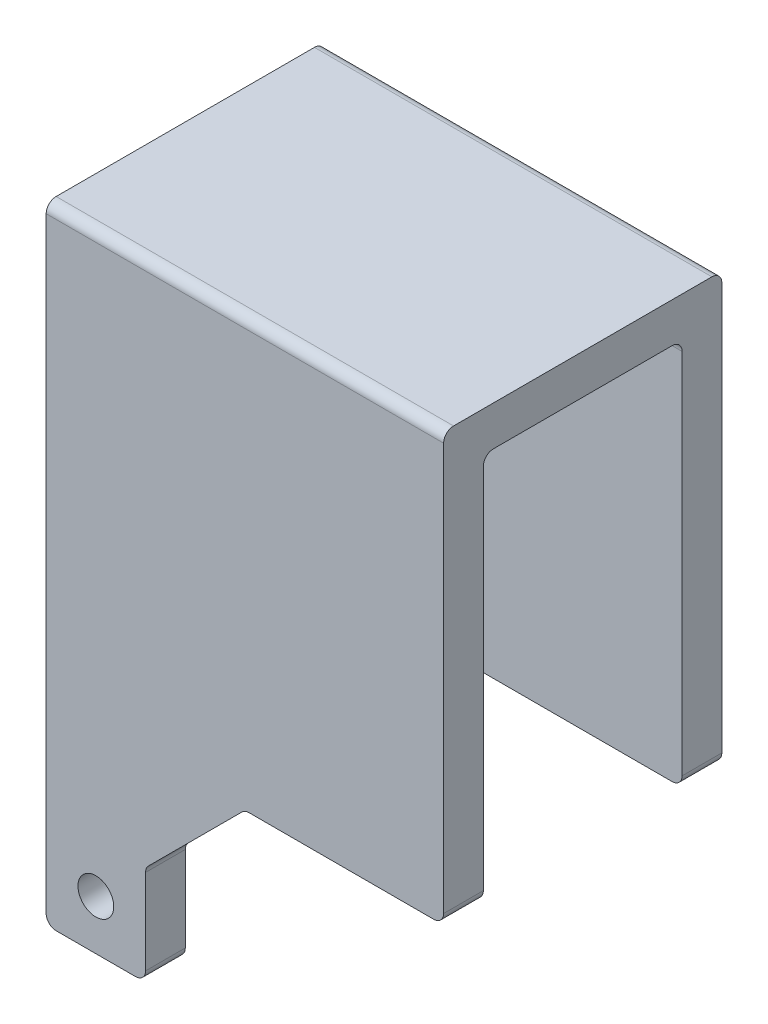
ISO-10303-21;
HEADER;
FILE_DESCRIPTION(('STEP AP214'),'2;1');
FILE_NAME('part.step','',(''),(''),'','','');
FILE_SCHEMA(('AUTOMOTIVE_DESIGN { 1 0 10303 214 1 1 1 1 }'));
ENDSEC;
DATA;
#1=APPLICATION_CONTEXT('core data for automotive mechanical design processes');
#2=APPLICATION_PROTOCOL_DEFINITION('international standard','automotive_design',2000,#1);
#3=PRODUCT_CONTEXT('',#1,'mechanical');
#4=PRODUCT('Part','Part','',(#3));
#5=PRODUCT_RELATED_PRODUCT_CATEGORY('part','',(#4));
#6=PRODUCT_DEFINITION_FORMATION('','',#4);
#7=PRODUCT_DEFINITION_CONTEXT('part definition',#1,'design');
#8=PRODUCT_DEFINITION('design','',#6,#7);
#9=PRODUCT_DEFINITION_SHAPE('','',#8);
#10=(LENGTH_UNIT() NAMED_UNIT(*) SI_UNIT(.MILLI.,.METRE.));
#11=(NAMED_UNIT(*) PLANE_ANGLE_UNIT() SI_UNIT($,.RADIAN.));
#12=(NAMED_UNIT(*) SI_UNIT($,.STERADIAN.) SOLID_ANGLE_UNIT());
#13=UNCERTAINTY_MEASURE_WITH_UNIT(LENGTH_MEASURE(1.E-05),#10,'distance_accuracy_value','');
#14=(GEOMETRIC_REPRESENTATION_CONTEXT(3) GLOBAL_UNCERTAINTY_ASSIGNED_CONTEXT((#13)) GLOBAL_UNIT_ASSIGNED_CONTEXT((#10,
#11,#12)) REPRESENTATION_CONTEXT('',''));
#15=CARTESIAN_POINT('',(0.,0.,0.));
#16=DIRECTION('',(0.,0.,1.));
#17=DIRECTION('',(1.,0.,0.));
#18=AXIS2_PLACEMENT_3D('',#15,#16,#17);
#19=CARTESIAN_POINT('',(0.,0.,-24.));
#20=DIRECTION('',(0.,0.,1.));
#21=DIRECTION('',(1.,0.,0.));
#22=AXIS2_PLACEMENT_3D('',#19,#20,#21);
#23=PLANE('',#22);
#24=DIRECTION('',(0.,-1.,0.));
#25=VECTOR('',#24,1.);
#26=CARTESIAN_POINT('',(20.,21.5,-24.));
#27=LINE('',#26,#25);
#28=CARTESIAN_POINT('',(20.,20.5,-24.));
#29=VERTEX_POINT('',#28);
#30=CARTESIAN_POINT('',(20.,-20.5,-24.));
#31=VERTEX_POINT('',#30);
#32=EDGE_CURVE('E518',#29,#31,#27,.T.);
#33=ORIENTED_EDGE('',*,*,#32,.T.);
#34=CARTESIAN_POINT('',(19.,-20.5,-24.));
#35=DIRECTION('',(0.,0.,1.));
#36=DIRECTION('',(1.,0.,0.));
#37=AXIS2_PLACEMENT_3D('',#34,#35,#36);
#38=CIRCLE('',#37,1.);
#39=CARTESIAN_POINT('',(19.,-21.5,-24.));
#40=VERTEX_POINT('',#39);
#41=EDGE_CURVE('E386',#31,#40,#38,.F.);
#42=ORIENTED_EDGE('',*,*,#41,.T.);
#43=DIRECTION('',(-1.,0.,0.));
#44=VECTOR('',#43,1.);
#45=CARTESIAN_POINT('',(-20.,-21.5,-24.));
#46=LINE('',#45,#44);
#47=CARTESIAN_POINT('',(0.414213562373093,-21.5,-24.));
#48=VERTEX_POINT('',#47);
#49=EDGE_CURVE('E246',#40,#48,#46,.T.);
#50=ORIENTED_EDGE('',*,*,#49,.T.);
#51=DIRECTION('',(0.,-1.,0.));
#52=VECTOR('',#51,1.);
#53=CARTESIAN_POINT('',(0.414213562373092,-17.5,-24.));
#54=LINE('',#53,#52);
#55=CARTESIAN_POINT('',(0.414213562373092,-16.5,-24.));
#56=VERTEX_POINT('',#55);
#57=EDGE_CURVE('E61',#48,#56,#54,.F.);
#58=ORIENTED_EDGE('',*,*,#57,.T.);
#59=DIRECTION('',(1.,0.,0.));
#60=VECTOR('',#59,1.);
#61=CARTESIAN_POINT('',(-20.,-16.5,-24.));
#62=LINE('',#61,#60);
#63=CARTESIAN_POINT('',(-20.,-16.5,-24.));
#64=VERTEX_POINT('',#63);
#65=EDGE_CURVE('E381',#56,#64,#62,.F.);
#66=ORIENTED_EDGE('',*,*,#65,.T.);
#67=DIRECTION('',(0.,1.,0.));
#68=VECTOR('',#67,1.);
#69=CARTESIAN_POINT('',(-20.,21.5,-24.));
#70=LINE('',#69,#68);
#71=CARTESIAN_POINT('',(-20.,20.5,-24.));
#72=VERTEX_POINT('',#71);
#73=EDGE_CURVE('E235',#64,#72,#70,.T.);
#74=ORIENTED_EDGE('',*,*,#73,.T.);
#75=DIRECTION('',(1.,0.,0.));
#76=VECTOR('',#75,1.);
#77=CARTESIAN_POINT('',(20.,20.5,-24.));
#78=LINE('',#77,#76);
#79=EDGE_CURVE('E383',#72,#29,#78,.T.);
#80=ORIENTED_EDGE('',*,*,#79,.T.);
#81=EDGE_LOOP('',(#33,#42,#50,#58,#66,#74,#80));
#82=FACE_BOUND('',#81,.T.);
#83=ADVANCED_FACE('F37',(#82),#23,.F.);
#84=CARTESIAN_POINT('',(0.,0.,0.));
#85=DIRECTION('',(0.,0.,1.));
#86=DIRECTION('',(1.,0.,0.));
#87=AXIS2_PLACEMENT_3D('',#84,#85,#86);
#88=PLANE('',#87);
#89=CARTESIAN_POINT('',(-15.,-36.5,0.));
#90=DIRECTION('',(0.,0.,1.));
#91=DIRECTION('',(1.,0.,0.));
#92=AXIS2_PLACEMENT_3D('',#89,#90,#91);
#93=CIRCLE('',#92,1.8);
#94=CARTESIAN_POINT('',(-13.2,-36.5,0.));
#95=VERTEX_POINT('',#94);
#96=EDGE_CURVE('E273',#95,#95,#93,.T.);
#97=ORIENTED_EDGE('',*,*,#96,.T.);
#98=EDGE_LOOP('',(#97));
#99=FACE_BOUND('',#98,.T.);
#100=DIRECTION('',(0.,1.,0.));
#101=VECTOR('',#100,1.);
#102=CARTESIAN_POINT('',(20.,0.,0.));
#103=LINE('',#102,#101);
#104=CARTESIAN_POINT('',(20.,-20.5,0.));
#105=VERTEX_POINT('',#104);
#106=CARTESIAN_POINT('',(20.,16.5,0.));
#107=VERTEX_POINT('',#106);
#108=EDGE_CURVE('E291',#105,#107,#103,.T.);
#109=ORIENTED_EDGE('',*,*,#108,.F.);
#110=CARTESIAN_POINT('',(19.,-20.5,0.));
#111=DIRECTION('',(0.,0.,1.));
#112=DIRECTION('',(1.,0.,0.));
#113=AXIS2_PLACEMENT_3D('',#110,#111,#112);
#114=CIRCLE('',#113,1.);
#115=CARTESIAN_POINT('',(19.,-21.5,0.));
#116=VERTEX_POINT('',#115);
#117=EDGE_CURVE('E362',#105,#116,#114,.F.);
#118=ORIENTED_EDGE('',*,*,#117,.T.);
#119=DIRECTION('',(1.,0.,0.));
#120=VECTOR('',#119,1.);
#121=CARTESIAN_POINT('',(0.,-21.5,0.));
#122=LINE('',#121,#120);
#123=CARTESIAN_POINT('',(0.414213562373094,-21.5,0.));
#124=VERTEX_POINT('',#123);
#125=EDGE_CURVE('E268',#124,#116,#122,.T.);
#126=ORIENTED_EDGE('',*,*,#125,.F.);
#127=CARTESIAN_POINT('',(0.414213562373094,-22.5,0.));
#128=DIRECTION('',(0.,0.,1.));
#129=DIRECTION('',(1.,0.,0.));
#130=AXIS2_PLACEMENT_3D('',#127,#128,#129);
#131=CIRCLE('',#130,1.);
#132=CARTESIAN_POINT('',(-0.292893218813452,-21.7928932188134,0.));
#133=VERTEX_POINT('',#132);
#134=EDGE_CURVE('E416',#124,#133,#131,.T.);
#135=ORIENTED_EDGE('',*,*,#134,.T.);
#136=DIRECTION('',(-0.707106781186548,-0.707106781186547,0.));
#137=VECTOR('',#136,1.);
#138=CARTESIAN_POINT('',(10.75,-10.75,0.));
#139=LINE('',#138,#137);
#140=CARTESIAN_POINT('',(-9.70710678118654,-31.2071067811865,0.));
#141=VERTEX_POINT('',#140);
#142=EDGE_CURVE('E316',#133,#141,#139,.T.);
#143=ORIENTED_EDGE('',*,*,#142,.T.);
#144=CARTESIAN_POINT('',(-8.99999999999999,-31.9142135623731,0.));
#145=DIRECTION('',(0.,0.,1.));
#146=DIRECTION('',(1.,0.,0.));
#147=AXIS2_PLACEMENT_3D('',#144,#145,#146);
#148=CIRCLE('',#147,1.);
#149=CARTESIAN_POINT('',(-9.99999999999999,-31.9142135623731,0.));
#150=VERTEX_POINT('',#149);
#151=EDGE_CURVE('E422',#141,#150,#148,.T.);
#152=ORIENTED_EDGE('',*,*,#151,.T.);
#153=DIRECTION('',(0.,-1.,0.));
#154=VECTOR('',#153,1.);
#155=CARTESIAN_POINT('',(-10.,0.,0.));
#156=LINE('',#155,#154);
#157=CARTESIAN_POINT('',(-9.99999999999999,-40.5,0.));
#158=VERTEX_POINT('',#157);
#159=EDGE_CURVE('E300',#150,#158,#156,.T.);
#160=ORIENTED_EDGE('',*,*,#159,.T.);
#161=CARTESIAN_POINT('',(-11.,-40.5,0.));
#162=DIRECTION('',(0.,0.,1.));
#163=DIRECTION('',(1.,0.,0.));
#164=AXIS2_PLACEMENT_3D('',#161,#162,#163);
#165=CIRCLE('',#164,1.);
#166=CARTESIAN_POINT('',(-11.,-41.5,0.));
#167=VERTEX_POINT('',#166);
#168=EDGE_CURVE('E358',#158,#167,#165,.F.);
#169=ORIENTED_EDGE('',*,*,#168,.T.);
#170=DIRECTION('',(1.,0.,0.));
#171=VECTOR('',#170,1.);
#172=CARTESIAN_POINT('',(0.,-41.5,0.));
#173=LINE('',#172,#171);
#174=CARTESIAN_POINT('',(-19.,-41.5,0.));
#175=VERTEX_POINT('',#174);
#176=EDGE_CURVE('E297',#175,#167,#173,.T.);
#177=ORIENTED_EDGE('',*,*,#176,.F.);
#178=CARTESIAN_POINT('',(-19.,-40.5,0.));
#179=DIRECTION('',(0.,0.,1.));
#180=DIRECTION('',(1.,0.,0.));
#181=AXIS2_PLACEMENT_3D('',#178,#179,#180);
#182=CIRCLE('',#181,1.);
#183=CARTESIAN_POINT('',(-20.,-40.5,0.));
#184=VERTEX_POINT('',#183);
#185=EDGE_CURVE('E360',#175,#184,#182,.F.);
#186=ORIENTED_EDGE('',*,*,#185,.T.);
#187=DIRECTION('',(0.,1.,0.));
#188=VECTOR('',#187,1.);
#189=CARTESIAN_POINT('',(-20.,0.,0.));
#190=LINE('',#189,#188);
#191=CARTESIAN_POINT('',(-20.,16.5,0.));
#192=VERTEX_POINT('',#191);
#193=EDGE_CURVE('E294',#184,#192,#190,.T.);
#194=ORIENTED_EDGE('',*,*,#193,.T.);
#195=DIRECTION('',(-1.,0.,0.));
#196=VECTOR('',#195,1.);
#197=CARTESIAN_POINT('',(20.,16.5,0.));
#198=LINE('',#197,#196);
#199=EDGE_CURVE('E356',#192,#107,#198,.F.);
#200=ORIENTED_EDGE('',*,*,#199,.T.);
#201=EDGE_LOOP('',(#109,#118,#126,#135,#143,#152,#160,#169,#177,#186,#194,#200));
#202=FACE_BOUND('',#201,.T.);
#203=ADVANCED_FACE('F455',(#99,#202),#88,.F.);
#204=CARTESIAN_POINT('',(0.,-21.5,4.));
#205=DIRECTION('',(0.,1.,0.));
#206=DIRECTION('',(0.,0.,1.));
#207=AXIS2_PLACEMENT_3D('',#204,#205,#206);
#208=PLANE('',#207);
#209=ORIENTED_EDGE('',*,*,#125,.T.);
#210=DIRECTION('',(0.,0.,-1.));
#211=VECTOR('',#210,1.);
#212=CARTESIAN_POINT('',(19.,-21.5,4.));
#213=LINE('',#212,#211);
#214=CARTESIAN_POINT('',(19.,-21.5,4.));
#215=VERTEX_POINT('',#214);
#216=EDGE_CURVE('E367',#116,#215,#213,.F.);
#217=ORIENTED_EDGE('',*,*,#216,.T.);
#218=DIRECTION('',(1.,0.,0.));
#219=VECTOR('',#218,1.);
#220=CARTESIAN_POINT('',(0.,-21.5,4.));
#221=LINE('',#220,#219);
#222=CARTESIAN_POINT('',(0.414213562373094,-21.5,4.));
#223=VERTEX_POINT('',#222);
#224=EDGE_CURVE('E269',#223,#215,#221,.T.);
#225=ORIENTED_EDGE('',*,*,#224,.F.);
#226=DIRECTION('',(0.,0.,-1.));
#227=VECTOR('',#226,1.);
#228=CARTESIAN_POINT('',(0.414213562373094,-21.5,0.));
#229=LINE('',#228,#227);
#230=EDGE_CURVE('E364',#223,#124,#229,.T.);
#231=ORIENTED_EDGE('',*,*,#230,.T.);
#232=EDGE_LOOP('',(#209,#217,#225,#231));
#233=FACE_BOUND('',#232,.T.);
#234=ADVANCED_FACE('F494',(#233),#208,.F.);
#235=CARTESIAN_POINT('',(20.,0.,4.));
#236=DIRECTION('',(-1.,0.,0.));
#237=DIRECTION('',(0.,0.,1.));
#238=AXIS2_PLACEMENT_3D('',#235,#236,#237);
#239=PLANE('',#238);
#240=DIRECTION('',(0.,1.,0.));
#241=VECTOR('',#240,1.);
#242=CARTESIAN_POINT('',(20.,0.,4.));
#243=LINE('',#242,#241);
#244=CARTESIAN_POINT('',(20.,-20.5,4.));
#245=VERTEX_POINT('',#244);
#246=CARTESIAN_POINT('',(20.,20.5,4.));
#247=VERTEX_POINT('',#246);
#248=EDGE_CURVE('E272',#245,#247,#243,.T.);
#249=ORIENTED_EDGE('',*,*,#248,.F.);
#250=DIRECTION('',(0.,0.,-1.));
#251=VECTOR('',#250,1.);
#252=CARTESIAN_POINT('',(20.,-20.5,4.));
#253=LINE('',#252,#251);
#254=EDGE_CURVE('E353',#245,#105,#253,.T.);
#255=ORIENTED_EDGE('',*,*,#254,.T.);
#256=ORIENTED_EDGE('',*,*,#108,.T.);
#257=CARTESIAN_POINT('',(20.,16.5,-1.));
#258=DIRECTION('',(-1.,0.,0.));
#259=DIRECTION('',(0.,0.,1.));
#260=AXIS2_PLACEMENT_3D('',#257,#258,#259);
#261=CIRCLE('',#260,1.);
#262=CARTESIAN_POINT('',(20.,17.5,-1.));
#263=VERTEX_POINT('',#262);
#264=EDGE_CURVE('E430',#107,#263,#261,.T.);
#265=ORIENTED_EDGE('',*,*,#264,.T.);
#266=DIRECTION('',(0.,0.,1.));
#267=VECTOR('',#266,1.);
#268=CARTESIAN_POINT('',(20.,17.5,-20.));
#269=LINE('',#268,#267);
#270=CARTESIAN_POINT('',(20.,17.5,-19.));
#271=VERTEX_POINT('',#270);
#272=EDGE_CURVE('E265',#271,#263,#269,.T.);
#273=ORIENTED_EDGE('',*,*,#272,.F.);
#274=CARTESIAN_POINT('',(20.,16.5,-19.));
#275=DIRECTION('',(-1.,0.,0.));
#276=DIRECTION('',(0.,0.,1.));
#277=AXIS2_PLACEMENT_3D('',#274,#275,#276);
#278=CIRCLE('',#277,1.);
#279=CARTESIAN_POINT('',(20.,16.5,-20.));
#280=VERTEX_POINT('',#279);
#281=EDGE_CURVE('E46',#271,#280,#278,.T.);
#282=ORIENTED_EDGE('',*,*,#281,.T.);
#283=DIRECTION('',(0.,-1.,0.));
#284=VECTOR('',#283,1.);
#285=CARTESIAN_POINT('',(20.,21.5,-20.));
#286=LINE('',#285,#284);
#287=CARTESIAN_POINT('',(20.,-20.5,-20.));
#288=VERTEX_POINT('',#287);
#289=EDGE_CURVE('E236',#280,#288,#286,.T.);
#290=ORIENTED_EDGE('',*,*,#289,.T.);
#291=DIRECTION('',(0.,0.,1.));
#292=VECTOR('',#291,1.);
#293=CARTESIAN_POINT('',(20.,-20.5,4.));
#294=LINE('',#293,#292);
#295=EDGE_CURVE('E351',#288,#31,#294,.F.);
#296=ORIENTED_EDGE('',*,*,#295,.T.);
#297=ORIENTED_EDGE('',*,*,#32,.F.);
#298=CARTESIAN_POINT('',(20.,20.5,-23.));
#299=DIRECTION('',(-1.,0.,0.));
#300=DIRECTION('',(0.,0.,1.));
#301=AXIS2_PLACEMENT_3D('',#298,#299,#300);
#302=CIRCLE('',#301,1.);
#303=CARTESIAN_POINT('',(20.,21.5,-23.));
#304=VERTEX_POINT('',#303);
#305=EDGE_CURVE('E349',#29,#304,#302,.F.);
#306=ORIENTED_EDGE('',*,*,#305,.T.);
#307=DIRECTION('',(0.,0.,-1.));
#308=VECTOR('',#307,1.);
#309=CARTESIAN_POINT('',(20.,21.5,4.));
#310=LINE('',#309,#308);
#311=CARTESIAN_POINT('',(20.,21.5,3.));
#312=VERTEX_POINT('',#311);
#313=EDGE_CURVE('E307',#312,#304,#310,.T.);
#314=ORIENTED_EDGE('',*,*,#313,.F.);
#315=CARTESIAN_POINT('',(20.,20.5,3.));
#316=DIRECTION('',(-1.,0.,0.));
#317=DIRECTION('',(0.,0.,1.));
#318=AXIS2_PLACEMENT_3D('',#315,#316,#317);
#319=CIRCLE('',#318,1.);
#320=EDGE_CURVE('E347',#312,#247,#319,.F.);
#321=ORIENTED_EDGE('',*,*,#320,.T.);
#322=EDGE_LOOP('',(#249,#255,#256,#265,#273,#282,#290,#296,#297,#306,#314,#321));
#323=FACE_BOUND('',#322,.T.);
#324=ADVANCED_FACE('F438',(#323),#239,.F.);
#325=CARTESIAN_POINT('',(0.,21.5,4.));
#326=DIRECTION('',(0.,1.,0.));
#327=DIRECTION('',(0.,0.,1.));
#328=AXIS2_PLACEMENT_3D('',#325,#326,#327);
#329=PLANE('',#328);
#330=ORIENTED_EDGE('',*,*,#313,.T.);
#331=DIRECTION('',(1.,0.,0.));
#332=VECTOR('',#331,1.);
#333=CARTESIAN_POINT('',(-20.,21.5,-23.));
#334=LINE('',#333,#332);
#335=CARTESIAN_POINT('',(-20.,21.5,-23.));
#336=VERTEX_POINT('',#335);
#337=EDGE_CURVE('E391',#304,#336,#334,.F.);
#338=ORIENTED_EDGE('',*,*,#337,.T.);
#339=DIRECTION('',(0.,0.,-1.));
#340=VECTOR('',#339,1.);
#341=CARTESIAN_POINT('',(-20.,21.5,4.));
#342=LINE('',#341,#340);
#343=CARTESIAN_POINT('',(-20.,21.5,3.));
#344=VERTEX_POINT('',#343);
#345=EDGE_CURVE('E288',#344,#336,#342,.T.);
#346=ORIENTED_EDGE('',*,*,#345,.F.);
#347=DIRECTION('',(1.,0.,0.));
#348=VECTOR('',#347,1.);
#349=CARTESIAN_POINT('',(0.,21.5,3.));
#350=LINE('',#349,#348);
#351=EDGE_CURVE('E388',#344,#312,#350,.T.);
#352=ORIENTED_EDGE('',*,*,#351,.T.);
#353=EDGE_LOOP('',(#330,#338,#346,#352));
#354=FACE_BOUND('',#353,.T.);
#355=ADVANCED_FACE('F508',(#354),#329,.T.);
#356=CARTESIAN_POINT('',(-20.,0.,4.));
#357=DIRECTION('',(-1.,0.,0.));
#358=DIRECTION('',(0.,0.,1.));
#359=AXIS2_PLACEMENT_3D('',#356,#357,#358);
#360=PLANE('',#359);
#361=DIRECTION('',(0.,0.,1.));
#362=VECTOR('',#361,1.);
#363=CARTESIAN_POINT('',(-20.,-17.5,-34.));
#364=LINE('',#363,#362);
#365=CARTESIAN_POINT('',(-20.,-17.5,-33.));
#366=VERTEX_POINT('',#365);
#367=CARTESIAN_POINT('',(-20.,-17.5,-25.));
#368=VERTEX_POINT('',#367);
#369=EDGE_CURVE('E253',#366,#368,#364,.T.);
#370=ORIENTED_EDGE('',*,*,#369,.F.);
#371=DIRECTION('',(0.,1.,0.));
#372=VECTOR('',#371,1.);
#373=CARTESIAN_POINT('',(-20.,-21.5,-33.));
#374=LINE('',#373,#372);
#375=CARTESIAN_POINT('',(-20.,-21.5,-33.));
#376=VERTEX_POINT('',#375);
#377=EDGE_CURVE('E244',#366,#376,#374,.F.);
#378=ORIENTED_EDGE('',*,*,#377,.T.);
#379=DIRECTION('',(0.,0.,1.));
#380=VECTOR('',#379,1.);
#381=CARTESIAN_POINT('',(-20.,-21.5,-24.));
#382=LINE('',#381,#380);
#383=CARTESIAN_POINT('',(-20.,-21.5,-20.));
#384=VERTEX_POINT('',#383);
#385=EDGE_CURVE('E228',#376,#384,#382,.T.);
#386=ORIENTED_EDGE('',*,*,#385,.T.);
#387=DIRECTION('',(0.,1.,0.));
#388=VECTOR('',#387,1.);
#389=CARTESIAN_POINT('',(-20.,21.5,-20.));
#390=LINE('',#389,#388);
#391=CARTESIAN_POINT('',(-20.,16.5,-20.));
#392=VERTEX_POINT('',#391);
#393=EDGE_CURVE('E242',#384,#392,#390,.T.);
#394=ORIENTED_EDGE('',*,*,#393,.T.);
#395=CARTESIAN_POINT('',(-20.,16.5,-19.));
#396=DIRECTION('',(-1.,0.,0.));
#397=DIRECTION('',(0.,0.,1.));
#398=AXIS2_PLACEMENT_3D('',#395,#396,#397);
#399=CIRCLE('',#398,1.);
#400=CARTESIAN_POINT('',(-20.,17.5,-19.));
#401=VERTEX_POINT('',#400);
#402=EDGE_CURVE('E432',#392,#401,#399,.F.);
#403=ORIENTED_EDGE('',*,*,#402,.T.);
#404=DIRECTION('',(0.,0.,1.));
#405=VECTOR('',#404,1.);
#406=CARTESIAN_POINT('',(-20.,17.5,-20.));
#407=LINE('',#406,#405);
#408=CARTESIAN_POINT('',(-20.,17.5,-1.));
#409=VERTEX_POINT('',#408);
#410=EDGE_CURVE('E245',#401,#409,#407,.T.);
#411=ORIENTED_EDGE('',*,*,#410,.T.);
#412=CARTESIAN_POINT('',(-20.,16.5,-1.));
#413=DIRECTION('',(-1.,0.,0.));
#414=DIRECTION('',(0.,0.,1.));
#415=AXIS2_PLACEMENT_3D('',#412,#413,#414);
#416=CIRCLE('',#415,1.);
#417=EDGE_CURVE('E428',#409,#192,#416,.F.);
#418=ORIENTED_EDGE('',*,*,#417,.T.);
#419=ORIENTED_EDGE('',*,*,#193,.F.);
#420=DIRECTION('',(0.,0.,-1.));
#421=VECTOR('',#420,1.);
#422=CARTESIAN_POINT('',(-20.,-40.5,4.));
#423=LINE('',#422,#421);
#424=CARTESIAN_POINT('',(-20.,-40.5,4.));
#425=VERTEX_POINT('',#424);
#426=EDGE_CURVE('E335',#184,#425,#423,.F.);
#427=ORIENTED_EDGE('',*,*,#426,.T.);
#428=DIRECTION('',(0.,1.,0.));
#429=VECTOR('',#428,1.);
#430=CARTESIAN_POINT('',(-20.,0.,4.));
#431=LINE('',#430,#429);
#432=CARTESIAN_POINT('',(-20.,20.5,4.));
#433=VERTEX_POINT('',#432);
#434=EDGE_CURVE('E276',#425,#433,#431,.T.);
#435=ORIENTED_EDGE('',*,*,#434,.T.);
#436=CARTESIAN_POINT('',(-20.,20.5,3.));
#437=DIRECTION('',(-1.,0.,0.));
#438=DIRECTION('',(0.,0.,1.));
#439=AXIS2_PLACEMENT_3D('',#436,#437,#438);
#440=CIRCLE('',#439,1.);
#441=EDGE_CURVE('E337',#433,#344,#440,.T.);
#442=ORIENTED_EDGE('',*,*,#441,.T.);
#443=ORIENTED_EDGE('',*,*,#345,.T.);
#444=CARTESIAN_POINT('',(-20.,20.5,-23.));
#445=DIRECTION('',(-1.,0.,0.));
#446=DIRECTION('',(0.,0.,1.));
#447=AXIS2_PLACEMENT_3D('',#444,#445,#446);
#448=CIRCLE('',#447,1.);
#449=EDGE_CURVE('E339',#336,#72,#448,.T.);
#450=ORIENTED_EDGE('',*,*,#449,.T.);
#451=ORIENTED_EDGE('',*,*,#73,.F.);
#452=CARTESIAN_POINT('',(-20.,-16.5,-25.));
#453=DIRECTION('',(-1.,0.,0.));
#454=DIRECTION('',(0.,0.,1.));
#455=AXIS2_PLACEMENT_3D('',#452,#453,#454);
#456=CIRCLE('',#455,1.);
#457=EDGE_CURVE('E426',#64,#368,#456,.F.);
#458=ORIENTED_EDGE('',*,*,#457,.T.);
#459=EDGE_LOOP('',(#370,#378,#386,#394,#403,#411,#418,#419,#427,#435,#442,#443,#450,#451,#458));
#460=FACE_BOUND('',#459,.T.);
#461=ADVANCED_FACE('F241',(#460),#360,.T.);
#462=CARTESIAN_POINT('',(0.,-41.5,4.));
#463=DIRECTION('',(0.,1.,0.));
#464=DIRECTION('',(0.,0.,1.));
#465=AXIS2_PLACEMENT_3D('',#462,#463,#464);
#466=PLANE('',#465);
#467=DIRECTION('',(1.,0.,0.));
#468=VECTOR('',#467,1.);
#469=CARTESIAN_POINT('',(0.,-41.5,4.));
#470=LINE('',#469,#468);
#471=CARTESIAN_POINT('',(-19.,-41.5,4.));
#472=VERTEX_POINT('',#471);
#473=CARTESIAN_POINT('',(-11.,-41.5,4.));
#474=VERTEX_POINT('',#473);
#475=EDGE_CURVE('E279',#472,#474,#470,.T.);
#476=ORIENTED_EDGE('',*,*,#475,.F.);
#477=DIRECTION('',(0.,0.,-1.));
#478=VECTOR('',#477,1.);
#479=CARTESIAN_POINT('',(-19.,-41.5,0.));
#480=LINE('',#479,#478);
#481=EDGE_CURVE('E395',#472,#175,#480,.T.);
#482=ORIENTED_EDGE('',*,*,#481,.T.);
#483=ORIENTED_EDGE('',*,*,#176,.T.);
#484=DIRECTION('',(0.,0.,-1.));
#485=VECTOR('',#484,1.);
#486=CARTESIAN_POINT('',(-11.,-41.5,4.));
#487=LINE('',#486,#485);
#488=EDGE_CURVE('E393',#167,#474,#487,.F.);
#489=ORIENTED_EDGE('',*,*,#488,.T.);
#490=EDGE_LOOP('',(#476,#482,#483,#489));
#491=FACE_BOUND('',#490,.T.);
#492=ADVANCED_FACE('F463',(#491),#466,.F.);
#493=CARTESIAN_POINT('',(-10.,0.,4.));
#494=DIRECTION('',(1.,0.,0.));
#495=DIRECTION('',(0.,1.,0.));
#496=AXIS2_PLACEMENT_3D('',#493,#494,#495);
#497=PLANE('',#496);
#498=DIRECTION('',(0.,-1.,0.));
#499=VECTOR('',#498,1.);
#500=CARTESIAN_POINT('',(-10.,0.,4.));
#501=LINE('',#500,#499);
#502=CARTESIAN_POINT('',(-9.99999999999999,-31.9142135623731,4.));
#503=VERTEX_POINT('',#502);
#504=CARTESIAN_POINT('',(-9.99999999999999,-40.5,4.));
#505=VERTEX_POINT('',#504);
#506=EDGE_CURVE('E282',#503,#505,#501,.T.);
#507=ORIENTED_EDGE('',*,*,#506,.T.);
#508=DIRECTION('',(0.,0.,-1.));
#509=VECTOR('',#508,1.);
#510=CARTESIAN_POINT('',(-9.99999999999999,-40.5,0.));
#511=LINE('',#510,#509);
#512=EDGE_CURVE('E401',#505,#158,#511,.T.);
#513=ORIENTED_EDGE('',*,*,#512,.T.);
#514=ORIENTED_EDGE('',*,*,#159,.F.);
#515=DIRECTION('',(0.,0.,1.));
#516=VECTOR('',#515,1.);
#517=CARTESIAN_POINT('',(-9.99999999999999,-31.9142135623731,4.));
#518=LINE('',#517,#516);
#519=EDGE_CURVE('E398',#150,#503,#518,.T.);
#520=ORIENTED_EDGE('',*,*,#519,.T.);
#521=EDGE_LOOP('',(#507,#513,#514,#520));
#522=FACE_BOUND('',#521,.T.);
#523=ADVANCED_FACE('F476',(#522),#497,.T.);
#524=CARTESIAN_POINT('',(-15.,-36.5,4.));
#525=DIRECTION('',(0.,0.,-1.));
#526=DIRECTION('',(-1.,0.,0.));
#527=AXIS2_PLACEMENT_3D('',#524,#525,#526);
#528=CYLINDRICAL_SURFACE('',#527,1.8);
#529=CARTESIAN_POINT('',(-15.,-36.5,4.));
#530=DIRECTION('',(0.,0.,1.));
#531=DIRECTION('',(1.,0.,0.));
#532=AXIS2_PLACEMENT_3D('',#529,#530,#531);
#533=CIRCLE('',#532,1.8);
#534=CARTESIAN_POINT('',(-13.2,-36.5,4.));
#535=VERTEX_POINT('',#534);
#536=EDGE_CURVE('E285',#535,#535,#533,.T.);
#537=ORIENTED_EDGE('',*,*,#536,.T.);
#538=EDGE_LOOP('',(#537));
#539=FACE_BOUND('',#538,.T.);
#540=ORIENTED_EDGE('',*,*,#96,.F.);
#541=EDGE_LOOP('',(#540));
#542=FACE_BOUND('',#541,.T.);
#543=ADVANCED_FACE('F591',(#539,#542),#528,.F.);
#544=CARTESIAN_POINT('',(0.,0.,4.));
#545=DIRECTION('',(0.,0.,1.));
#546=DIRECTION('',(1.,0.,0.));
#547=AXIS2_PLACEMENT_3D('',#544,#545,#546);
#548=PLANE('',#547);
#549=ORIENTED_EDGE('',*,*,#224,.T.);
#550=CARTESIAN_POINT('',(19.,-20.5,4.));
#551=DIRECTION('',(0.,0.,1.));
#552=DIRECTION('',(1.,0.,0.));
#553=AXIS2_PLACEMENT_3D('',#550,#551,#552);
#554=CIRCLE('',#553,1.);
#555=EDGE_CURVE('E375',#215,#245,#554,.T.);
#556=ORIENTED_EDGE('',*,*,#555,.T.);
#557=ORIENTED_EDGE('',*,*,#248,.T.);
#558=DIRECTION('',(1.,0.,0.));
#559=VECTOR('',#558,1.);
#560=CARTESIAN_POINT('',(0.,20.5,4.));
#561=LINE('',#560,#559);
#562=EDGE_CURVE('E373',#247,#433,#561,.F.);
#563=ORIENTED_EDGE('',*,*,#562,.T.);
#564=ORIENTED_EDGE('',*,*,#434,.F.);
#565=CARTESIAN_POINT('',(-19.,-40.5,4.));
#566=DIRECTION('',(0.,0.,1.));
#567=DIRECTION('',(1.,0.,0.));
#568=AXIS2_PLACEMENT_3D('',#565,#566,#567);
#569=CIRCLE('',#568,1.);
#570=EDGE_CURVE('E371',#425,#472,#569,.T.);
#571=ORIENTED_EDGE('',*,*,#570,.T.);
#572=ORIENTED_EDGE('',*,*,#475,.T.);
#573=CARTESIAN_POINT('',(-11.,-40.5,4.));
#574=DIRECTION('',(0.,0.,1.));
#575=DIRECTION('',(1.,0.,0.));
#576=AXIS2_PLACEMENT_3D('',#573,#574,#575);
#577=CIRCLE('',#576,1.);
#578=EDGE_CURVE('E369',#474,#505,#577,.T.);
#579=ORIENTED_EDGE('',*,*,#578,.T.);
#580=ORIENTED_EDGE('',*,*,#506,.F.);
#581=CARTESIAN_POINT('',(-8.99999999999999,-31.9142135623731,4.));
#582=DIRECTION('',(0.,0.,1.));
#583=DIRECTION('',(1.,0.,0.));
#584=AXIS2_PLACEMENT_3D('',#581,#582,#583);
#585=CIRCLE('',#584,1.);
#586=CARTESIAN_POINT('',(-9.70710678118654,-31.2071067811865,4.));
#587=VERTEX_POINT('',#586);
#588=EDGE_CURVE('E420',#503,#587,#585,.F.);
#589=ORIENTED_EDGE('',*,*,#588,.T.);
#590=DIRECTION('',(0.707106781186548,0.707106781186547,0.));
#591=VECTOR('',#590,1.);
#592=CARTESIAN_POINT('',(0.,-21.5,4.));
#593=LINE('',#592,#591);
#594=CARTESIAN_POINT('',(-0.292893218813453,-21.7928932188134,4.));
#595=VERTEX_POINT('',#594);
#596=EDGE_CURVE('E319',#587,#595,#593,.T.);
#597=ORIENTED_EDGE('',*,*,#596,.T.);
#598=CARTESIAN_POINT('',(0.414213562373094,-22.5,4.));
#599=DIRECTION('',(0.,0.,1.));
#600=DIRECTION('',(1.,0.,0.));
#601=AXIS2_PLACEMENT_3D('',#598,#599,#600);
#602=CIRCLE('',#601,1.);
#603=EDGE_CURVE('E418',#595,#223,#602,.F.);
#604=ORIENTED_EDGE('',*,*,#603,.T.);
#605=EDGE_LOOP('',(#549,#556,#557,#563,#564,#571,#572,#579,#580,#589,#597,#604));
#606=FACE_BOUND('',#605,.T.);
#607=ORIENTED_EDGE('',*,*,#536,.F.);
#608=EDGE_LOOP('',(#607));
#609=FACE_BOUND('',#608,.T.);
#610=ADVANCED_FACE('F467',(#606,#609),#548,.T.);
#611=CARTESIAN_POINT('',(20.,17.5,-20.));
#612=DIRECTION('',(0.,1.,0.));
#613=DIRECTION('',(0.,0.,1.));
#614=AXIS2_PLACEMENT_3D('',#611,#612,#613);
#615=PLANE('',#614);
#616=ORIENTED_EDGE('',*,*,#272,.T.);
#617=DIRECTION('',(-1.,0.,0.));
#618=VECTOR('',#617,1.);
#619=CARTESIAN_POINT('',(-20.,17.5,-1.));
#620=LINE('',#619,#618);
#621=EDGE_CURVE('E410',#263,#409,#620,.T.);
#622=ORIENTED_EDGE('',*,*,#621,.T.);
#623=ORIENTED_EDGE('',*,*,#410,.F.);
#624=DIRECTION('',(-1.,0.,0.));
#625=VECTOR('',#624,1.);
#626=CARTESIAN_POINT('',(20.,17.5,-19.));
#627=LINE('',#626,#625);
#628=EDGE_CURVE('E408',#401,#271,#627,.F.);
#629=ORIENTED_EDGE('',*,*,#628,.T.);
#630=EDGE_LOOP('',(#616,#622,#623,#629));
#631=FACE_BOUND('',#630,.T.);
#632=ADVANCED_FACE('F445',(#631),#615,.F.);
#633=CARTESIAN_POINT('',(-20.,-21.5,-24.));
#634=DIRECTION('',(0.,1.,0.));
#635=DIRECTION('',(-1.,0.,0.));
#636=AXIS2_PLACEMENT_3D('',#633,#634,#635);
#637=PLANE('',#636);
#638=CARTESIAN_POINT('',(-15.,-21.5,-29.));
#639=DIRECTION('',(0.,1.,0.));
#640=DIRECTION('',(0.,0.,1.));
#641=AXIS2_PLACEMENT_3D('',#638,#639,#640);
#642=CIRCLE('',#641,1.8);
#643=CARTESIAN_POINT('',(-15.,-21.5,-27.2));
#644=VERTEX_POINT('',#643);
#645=EDGE_CURVE('E527',#644,#644,#642,.T.);
#646=ORIENTED_EDGE('',*,*,#645,.T.);
#647=EDGE_LOOP('',(#646));
#648=FACE_BOUND('',#647,.T.);
#649=ORIENTED_EDGE('',*,*,#385,.F.);
#650=CARTESIAN_POINT('',(-19.,-21.5,-33.));
#651=DIRECTION('',(0.,1.,0.));
#652=DIRECTION('',(-1.,0.,0.));
#653=AXIS2_PLACEMENT_3D('',#650,#651,#652);
#654=CIRCLE('',#653,1.);
#655=CARTESIAN_POINT('',(-19.,-21.5,-34.));
#656=VERTEX_POINT('',#655);
#657=EDGE_CURVE('E345',#376,#656,#654,.F.);
#658=ORIENTED_EDGE('',*,*,#657,.T.);
#659=DIRECTION('',(-1.,0.,0.));
#660=VECTOR('',#659,1.);
#661=CARTESIAN_POINT('',(-10.,-21.5,-34.));
#662=LINE('',#661,#660);
#663=CARTESIAN_POINT('',(-10.4142135623731,-21.5,-34.));
#664=VERTEX_POINT('',#663);
#665=EDGE_CURVE('E524',#664,#656,#662,.T.);
#666=ORIENTED_EDGE('',*,*,#665,.F.);
#667=CARTESIAN_POINT('',(-10.4142135623731,-21.5,-33.));
#668=DIRECTION('',(0.,1.,0.));
#669=DIRECTION('',(-1.,0.,0.));
#670=AXIS2_PLACEMENT_3D('',#667,#668,#669);
#671=CIRCLE('',#670,1.);
#672=CARTESIAN_POINT('',(-9.70710678118655,-21.5,-33.7071067811865));
#673=VERTEX_POINT('',#672);
#674=EDGE_CURVE('E342',#664,#673,#671,.F.);
#675=ORIENTED_EDGE('',*,*,#674,.T.);
#676=DIRECTION('',(-0.707106781186548,0.,-0.707106781186548));
#677=VECTOR('',#676,1.);
#678=CARTESIAN_POINT('',(-10.,-21.5,-34.));
#679=LINE('',#678,#677);
#680=CARTESIAN_POINT('',(-0.292893218813454,-21.5,-24.2928932188135));
#681=VERTEX_POINT('',#680);
#682=EDGE_CURVE('E310',#673,#681,#679,.F.);
#683=ORIENTED_EDGE('',*,*,#682,.T.);
#684=CARTESIAN_POINT('',(0.414213562373092,-21.5,-25.));
#685=DIRECTION('',(0.,1.,0.));
#686=DIRECTION('',(-1.,0.,0.));
#687=AXIS2_PLACEMENT_3D('',#684,#685,#686);
#688=CIRCLE('',#687,1.);
#689=EDGE_CURVE('E11',#681,#48,#688,.T.);
#690=ORIENTED_EDGE('',*,*,#689,.T.);
#691=ORIENTED_EDGE('',*,*,#49,.F.);
#692=DIRECTION('',(0.,0.,1.));
#693=VECTOR('',#692,1.);
#694=CARTESIAN_POINT('',(19.,-21.5,-24.));
#695=LINE('',#694,#693);
#696=CARTESIAN_POINT('',(19.,-21.5,-20.));
#697=VERTEX_POINT('',#696);
#698=EDGE_CURVE('E232',#40,#697,#695,.T.);
#699=ORIENTED_EDGE('',*,*,#698,.T.);
#700=DIRECTION('',(-1.,0.,0.));
#701=VECTOR('',#700,1.);
#702=CARTESIAN_POINT('',(-20.,-21.5,-20.));
#703=LINE('',#702,#701);
#704=EDGE_CURVE('E225',#697,#384,#703,.T.);
#705=ORIENTED_EDGE('',*,*,#704,.T.);
#706=EDGE_LOOP('',(#649,#658,#666,#675,#683,#690,#691,#699,#705));
#707=FACE_BOUND('',#706,.T.);
#708=ADVANCED_FACE('F227',(#648,#707),#637,.F.);
#709=CARTESIAN_POINT('',(0.,0.,-20.));
#710=DIRECTION('',(0.,0.,1.));
#711=DIRECTION('',(1.,0.,0.));
#712=AXIS2_PLACEMENT_3D('',#709,#710,#711);
#713=PLANE('',#712);
#714=ORIENTED_EDGE('',*,*,#704,.F.);
#715=CARTESIAN_POINT('',(19.,-20.5,-20.));
#716=DIRECTION('',(0.,0.,1.));
#717=DIRECTION('',(1.,0.,0.));
#718=AXIS2_PLACEMENT_3D('',#715,#716,#717);
#719=CIRCLE('',#718,1.);
#720=EDGE_CURVE('E378',#697,#288,#719,.T.);
#721=ORIENTED_EDGE('',*,*,#720,.T.);
#722=ORIENTED_EDGE('',*,*,#289,.F.);
#723=DIRECTION('',(-1.,0.,0.));
#724=VECTOR('',#723,1.);
#725=CARTESIAN_POINT('',(0.,16.5,-20.));
#726=LINE('',#725,#724);
#727=EDGE_CURVE('E252',#280,#392,#726,.T.);
#728=ORIENTED_EDGE('',*,*,#727,.T.);
#729=ORIENTED_EDGE('',*,*,#393,.F.);
#730=EDGE_LOOP('',(#714,#721,#722,#728,#729));
#731=FACE_BOUND('',#730,.T.);
#732=ADVANCED_FACE('F249',(#731),#713,.T.);
#733=CARTESIAN_POINT('',(-10.,-17.5,-34.));
#734=DIRECTION('',(0.,-1.,0.));
#735=DIRECTION('',(0.,0.,-1.));
#736=AXIS2_PLACEMENT_3D('',#733,#734,#735);
#737=PLANE('',#736);
#738=CARTESIAN_POINT('',(-15.,-17.5,-29.));
#739=DIRECTION('',(0.,1.,0.));
#740=DIRECTION('',(0.,0.,1.));
#741=AXIS2_PLACEMENT_3D('',#738,#739,#740);
#742=CIRCLE('',#741,1.8);
#743=CARTESIAN_POINT('',(-15.,-17.5,-27.2));
#744=VERTEX_POINT('',#743);
#745=EDGE_CURVE('E528',#744,#744,#742,.T.);
#746=ORIENTED_EDGE('',*,*,#745,.F.);
#747=EDGE_LOOP('',(#746));
#748=FACE_BOUND('',#747,.T.);
#749=DIRECTION('',(1.,0.,0.));
#750=VECTOR('',#749,1.);
#751=CARTESIAN_POINT('',(-10.,-17.5,-34.));
#752=LINE('',#751,#750);
#753=CARTESIAN_POINT('',(-19.,-17.5,-34.));
#754=VERTEX_POINT('',#753);
#755=CARTESIAN_POINT('',(-10.4142135623731,-17.5,-34.));
#756=VERTEX_POINT('',#755);
#757=EDGE_CURVE('E258',#754,#756,#752,.T.);
#758=ORIENTED_EDGE('',*,*,#757,.F.);
#759=CARTESIAN_POINT('',(-19.,-17.5,-33.));
#760=DIRECTION('',(0.,-1.,0.));
#761=DIRECTION('',(0.,0.,-1.));
#762=AXIS2_PLACEMENT_3D('',#759,#760,#761);
#763=CIRCLE('',#762,1.);
#764=EDGE_CURVE('E333',#754,#366,#763,.F.);
#765=ORIENTED_EDGE('',*,*,#764,.T.);
#766=ORIENTED_EDGE('',*,*,#369,.T.);
#767=DIRECTION('',(1.,0.,0.));
#768=VECTOR('',#767,1.);
#769=CARTESIAN_POINT('',(0.,-17.5,-25.));
#770=LINE('',#769,#768);
#771=CARTESIAN_POINT('',(-0.999999999999996,-17.5,-25.));
#772=VERTEX_POINT('',#771);
#773=EDGE_CURVE('E330',#368,#772,#770,.T.);
#774=ORIENTED_EDGE('',*,*,#773,.T.);
#775=DIRECTION('',(0.707106781186548,0.,0.707106781186548));
#776=VECTOR('',#775,1.);
#777=CARTESIAN_POINT('',(-10.,-17.5,-34.));
#778=LINE('',#777,#776);
#779=CARTESIAN_POINT('',(-9.70710678118655,-17.5,-33.7071067811865));
#780=VERTEX_POINT('',#779);
#781=EDGE_CURVE('E313',#772,#780,#778,.F.);
#782=ORIENTED_EDGE('',*,*,#781,.T.);
#783=CARTESIAN_POINT('',(-10.4142135623731,-17.5,-33.));
#784=DIRECTION('',(0.,-1.,0.));
#785=DIRECTION('',(0.,0.,-1.));
#786=AXIS2_PLACEMENT_3D('',#783,#784,#785);
#787=CIRCLE('',#786,1.);
#788=EDGE_CURVE('E328',#780,#756,#787,.F.);
#789=ORIENTED_EDGE('',*,*,#788,.T.);
#790=EDGE_LOOP('',(#758,#765,#766,#774,#782,#789));
#791=FACE_BOUND('',#790,.T.);
#792=ADVANCED_FACE('F543',(#748,#791),#737,.F.);
#793=CARTESIAN_POINT('',(0.,0.,-34.));
#794=DIRECTION('',(0.,0.,1.));
#795=DIRECTION('',(1.,0.,0.));
#796=AXIS2_PLACEMENT_3D('',#793,#794,#795);
#797=PLANE('',#796);
#798=ORIENTED_EDGE('',*,*,#665,.T.);
#799=DIRECTION('',(0.,1.,0.));
#800=VECTOR('',#799,1.);
#801=CARTESIAN_POINT('',(-19.,-17.5,-34.));
#802=LINE('',#801,#800);
#803=EDGE_CURVE('E325',#656,#754,#802,.T.);
#804=ORIENTED_EDGE('',*,*,#803,.T.);
#805=ORIENTED_EDGE('',*,*,#757,.T.);
#806=DIRECTION('',(0.,1.,0.));
#807=VECTOR('',#806,1.);
#808=CARTESIAN_POINT('',(-10.4142135623731,0.,-34.));
#809=LINE('',#808,#807);
#810=EDGE_CURVE('E322',#756,#664,#809,.F.);
#811=ORIENTED_EDGE('',*,*,#810,.T.);
#812=EDGE_LOOP('',(#798,#804,#805,#811));
#813=FACE_BOUND('',#812,.T.);
#814=ADVANCED_FACE('F539',(#813),#797,.F.);
#815=CARTESIAN_POINT('',(-15.,-21.5,-29.));
#816=DIRECTION('',(0.,1.,0.));
#817=DIRECTION('',(0.,0.,1.));
#818=AXIS2_PLACEMENT_3D('',#815,#816,#817);
#819=CYLINDRICAL_SURFACE('',#818,1.8);
#820=ORIENTED_EDGE('',*,*,#645,.F.);
#821=EDGE_LOOP('',(#820));
#822=FACE_BOUND('',#821,.T.);
#823=ORIENTED_EDGE('',*,*,#745,.T.);
#824=EDGE_LOOP('',(#823));
#825=FACE_BOUND('',#824,.T.);
#826=ADVANCED_FACE('F535',(#822,#825),#819,.F.);
#827=CARTESIAN_POINT('',(-10.,-21.5,-34.));
#828=DIRECTION('',(0.707106781186548,0.,-0.707106781186548));
#829=DIRECTION('',(0.,1.,0.));
#830=AXIS2_PLACEMENT_3D('',#827,#828,#829);
#831=PLANE('',#830);
#832=CARTESIAN_POINT('',(-1.,-16.5,-25.));
#833=DIRECTION('',(0.707106781186548,0.,-0.707106781186548));
#834=DIRECTION('',(-0.707106781186548,0.,-0.707106781186548));
#835=AXIS2_PLACEMENT_3D('',#832,#833,#834);
#836=ELLIPSE('',#835,1.41421356237309,1.);
#837=CARTESIAN_POINT('',(-0.292893218813453,-17.2071067811865,-24.2928932188135));
#838=VERTEX_POINT('',#837);
#839=EDGE_CURVE('E424',#772,#838,#836,.F.);
#840=ORIENTED_EDGE('',*,*,#839,.T.);
#841=DIRECTION('',(0.,1.,0.));
#842=VECTOR('',#841,1.);
#843=CARTESIAN_POINT('',(-0.292893218813455,-21.5,-24.2928932188135));
#844=LINE('',#843,#842);
#845=EDGE_CURVE('E53',#838,#681,#844,.F.);
#846=ORIENTED_EDGE('',*,*,#845,.T.);
#847=ORIENTED_EDGE('',*,*,#682,.F.);
#848=DIRECTION('',(0.,-1.,0.));
#849=VECTOR('',#848,1.);
#850=CARTESIAN_POINT('',(-9.70710678118655,-21.5,-33.7071067811865));
#851=LINE('',#850,#849);
#852=EDGE_CURVE('E413',#673,#780,#851,.F.);
#853=ORIENTED_EDGE('',*,*,#852,.T.);
#854=ORIENTED_EDGE('',*,*,#781,.F.);
#855=EDGE_LOOP('',(#840,#846,#847,#853,#854));
#856=FACE_BOUND('',#855,.T.);
#857=ADVANCED_FACE('F538',(#856),#831,.T.);
#858=CARTESIAN_POINT('',(0.,-21.5,4.));
#859=DIRECTION('',(-0.707106781186547,0.707106781186548,0.));
#860=DIRECTION('',(0.,0.,-1.));
#861=AXIS2_PLACEMENT_3D('',#858,#859,#860);
#862=PLANE('',#861);
#863=ORIENTED_EDGE('',*,*,#142,.F.);
#864=DIRECTION('',(0.,0.,-1.));
#865=VECTOR('',#864,1.);
#866=CARTESIAN_POINT('',(-0.292893218813453,-21.7928932188134,4.));
#867=LINE('',#866,#865);
#868=EDGE_CURVE('E406',#133,#595,#867,.F.);
#869=ORIENTED_EDGE('',*,*,#868,.T.);
#870=ORIENTED_EDGE('',*,*,#596,.F.);
#871=DIRECTION('',(0.,0.,1.));
#872=VECTOR('',#871,1.);
#873=CARTESIAN_POINT('',(-9.70710678118654,-31.2071067811865,4.));
#874=LINE('',#873,#872);
#875=EDGE_CURVE('E404',#587,#141,#874,.F.);
#876=ORIENTED_EDGE('',*,*,#875,.T.);
#877=EDGE_LOOP('',(#863,#869,#870,#876));
#878=FACE_BOUND('',#877,.T.);
#879=ADVANCED_FACE('F486',(#878),#862,.F.);
#880=CARTESIAN_POINT('',(-19.,0.,-33.));
#881=DIRECTION('',(0.,-1.,0.));
#882=DIRECTION('',(0.,0.,-1.));
#883=AXIS2_PLACEMENT_3D('',#880,#881,#882);
#884=CYLINDRICAL_SURFACE('',#883,1.);
#885=ORIENTED_EDGE('',*,*,#657,.F.);
#886=ORIENTED_EDGE('',*,*,#377,.F.);
#887=ORIENTED_EDGE('',*,*,#764,.F.);
#888=ORIENTED_EDGE('',*,*,#803,.F.);
#889=EDGE_LOOP('',(#885,#886,#887,#888));
#890=FACE_BOUND('',#889,.T.);
#891=ADVANCED_FACE('F573',(#890),#884,.T.);
#892=CARTESIAN_POINT('',(19.,-20.5,4.));
#893=DIRECTION('',(0.,0.,-1.));
#894=DIRECTION('',(-1.,0.,0.));
#895=AXIS2_PLACEMENT_3D('',#892,#893,#894);
#896=CYLINDRICAL_SURFACE('',#895,1.);
#897=ORIENTED_EDGE('',*,*,#555,.F.);
#898=ORIENTED_EDGE('',*,*,#216,.F.);
#899=ORIENTED_EDGE('',*,*,#117,.F.);
#900=ORIENTED_EDGE('',*,*,#254,.F.);
#901=EDGE_LOOP('',(#897,#898,#899,#900));
#902=FACE_BOUND('',#901,.T.);
#903=ADVANCED_FACE('F498',(#902),#896,.T.);
#904=CARTESIAN_POINT('',(19.,-20.5,-24.));
#905=DIRECTION('',(0.,0.,1.));
#906=DIRECTION('',(1.,0.,0.));
#907=AXIS2_PLACEMENT_3D('',#904,#905,#906);
#908=CYLINDRICAL_SURFACE('',#907,1.);
#909=ORIENTED_EDGE('',*,*,#41,.F.);
#910=ORIENTED_EDGE('',*,*,#295,.F.);
#911=ORIENTED_EDGE('',*,*,#720,.F.);
#912=ORIENTED_EDGE('',*,*,#698,.F.);
#913=EDGE_LOOP('',(#909,#910,#911,#912));
#914=FACE_BOUND('',#913,.T.);
#915=ADVANCED_FACE('F565',(#914),#908,.T.);
#916=CARTESIAN_POINT('',(0.,20.5,-23.));
#917=DIRECTION('',(-1.,0.,0.));
#918=DIRECTION('',(0.,0.,1.));
#919=AXIS2_PLACEMENT_3D('',#916,#917,#918);
#920=CYLINDRICAL_SURFACE('',#919,1.);
#921=ORIENTED_EDGE('',*,*,#449,.F.);
#922=ORIENTED_EDGE('',*,*,#337,.F.);
#923=ORIENTED_EDGE('',*,*,#305,.F.);
#924=ORIENTED_EDGE('',*,*,#79,.F.);
#925=EDGE_LOOP('',(#921,#922,#923,#924));
#926=FACE_BOUND('',#925,.T.);
#927=ADVANCED_FACE('F515',(#926),#920,.T.);
#928=CARTESIAN_POINT('',(0.,20.5,3.));
#929=DIRECTION('',(1.,0.,0.));
#930=DIRECTION('',(0.,0.,-1.));
#931=AXIS2_PLACEMENT_3D('',#928,#929,#930);
#932=CYLINDRICAL_SURFACE('',#931,1.);
#933=ORIENTED_EDGE('',*,*,#441,.F.);
#934=ORIENTED_EDGE('',*,*,#562,.F.);
#935=ORIENTED_EDGE('',*,*,#320,.F.);
#936=ORIENTED_EDGE('',*,*,#351,.F.);
#937=EDGE_LOOP('',(#933,#934,#935,#936));
#938=FACE_BOUND('',#937,.T.);
#939=ADVANCED_FACE('F505',(#938),#932,.T.);
#940=CARTESIAN_POINT('',(-19.,-40.5,4.));
#941=DIRECTION('',(0.,0.,1.));
#942=DIRECTION('',(1.,0.,0.));
#943=AXIS2_PLACEMENT_3D('',#940,#941,#942);
#944=CYLINDRICAL_SURFACE('',#943,1.);
#945=ORIENTED_EDGE('',*,*,#570,.F.);
#946=ORIENTED_EDGE('',*,*,#426,.F.);
#947=ORIENTED_EDGE('',*,*,#185,.F.);
#948=ORIENTED_EDGE('',*,*,#481,.F.);
#949=EDGE_LOOP('',(#945,#946,#947,#948));
#950=FACE_BOUND('',#949,.T.);
#951=ADVANCED_FACE('F460',(#950),#944,.T.);
#952=CARTESIAN_POINT('',(-11.,-40.5,4.));
#953=DIRECTION('',(0.,0.,1.));
#954=DIRECTION('',(1.,0.,0.));
#955=AXIS2_PLACEMENT_3D('',#952,#953,#954);
#956=CYLINDRICAL_SURFACE('',#955,1.);
#957=ORIENTED_EDGE('',*,*,#578,.F.);
#958=ORIENTED_EDGE('',*,*,#488,.F.);
#959=ORIENTED_EDGE('',*,*,#168,.F.);
#960=ORIENTED_EDGE('',*,*,#512,.F.);
#961=EDGE_LOOP('',(#957,#958,#959,#960));
#962=FACE_BOUND('',#961,.T.);
#963=ADVANCED_FACE('F473',(#962),#956,.T.);
#964=CARTESIAN_POINT('',(0.414213562373094,-22.5,4.));
#965=DIRECTION('',(0.,0.,1.));
#966=DIRECTION('',(1.,0.,0.));
#967=AXIS2_PLACEMENT_3D('',#964,#965,#966);
#968=CYLINDRICAL_SURFACE('',#967,1.);
#969=ORIENTED_EDGE('',*,*,#603,.F.);
#970=ORIENTED_EDGE('',*,*,#868,.F.);
#971=ORIENTED_EDGE('',*,*,#134,.F.);
#972=ORIENTED_EDGE('',*,*,#230,.F.);
#973=EDGE_LOOP('',(#969,#970,#971,#972));
#974=FACE_BOUND('',#973,.T.);
#975=ADVANCED_FACE('F489',(#974),#968,.F.);
#976=CARTESIAN_POINT('',(-8.99999999999999,-31.9142135623731,4.));
#977=DIRECTION('',(0.,0.,1.));
#978=DIRECTION('',(1.,0.,0.));
#979=AXIS2_PLACEMENT_3D('',#976,#977,#978);
#980=CYLINDRICAL_SURFACE('',#979,1.);
#981=ORIENTED_EDGE('',*,*,#151,.F.);
#982=ORIENTED_EDGE('',*,*,#875,.F.);
#983=ORIENTED_EDGE('',*,*,#588,.F.);
#984=ORIENTED_EDGE('',*,*,#519,.F.);
#985=EDGE_LOOP('',(#981,#982,#983,#984));
#986=FACE_BOUND('',#985,.T.);
#987=ADVANCED_FACE('F482',(#986),#980,.F.);
#988=CARTESIAN_POINT('',(0.414213562373092,0.,-25.));
#989=DIRECTION('',(0.,1.,0.));
#990=DIRECTION('',(0.,0.,1.));
#991=AXIS2_PLACEMENT_3D('',#988,#989,#990);
#992=CYLINDRICAL_SURFACE('',#991,1.);
#993=ORIENTED_EDGE('',*,*,#845,.F.);
#994=CARTESIAN_POINT('',(0.414213562373093,-16.5,-25.));
#995=DIRECTION('',(-0.707106781186547,0.707106781186547,0.));
#996=DIRECTION('',(0.707106781186547,0.707106781186547,0.));
#997=AXIS2_PLACEMENT_3D('',#994,#995,#996);
#998=ELLIPSE('',#997,1.41421356237309,1.);
#999=EDGE_CURVE('E41',#56,#838,#998,.F.);
#1000=ORIENTED_EDGE('',*,*,#999,.F.);
#1001=ORIENTED_EDGE('',*,*,#57,.F.);
#1002=ORIENTED_EDGE('',*,*,#689,.F.);
#1003=EDGE_LOOP('',(#993,#1000,#1001,#1002));
#1004=FACE_BOUND('',#1003,.T.);
#1005=ADVANCED_FACE('F563',(#1004),#992,.F.);
#1006=CARTESIAN_POINT('',(-10.,-16.5,-25.));
#1007=DIRECTION('',(-1.,0.,0.));
#1008=DIRECTION('',(0.,0.,1.));
#1009=AXIS2_PLACEMENT_3D('',#1006,#1007,#1008);
#1010=CYLINDRICAL_SURFACE('',#1009,1.);
#1011=ORIENTED_EDGE('',*,*,#457,.F.);
#1012=ORIENTED_EDGE('',*,*,#65,.F.);
#1013=ORIENTED_EDGE('',*,*,#999,.T.);
#1014=ORIENTED_EDGE('',*,*,#839,.F.);
#1015=ORIENTED_EDGE('',*,*,#773,.F.);
#1016=EDGE_LOOP('',(#1011,#1012,#1013,#1014,#1015));
#1017=FACE_BOUND('',#1016,.T.);
#1018=ADVANCED_FACE('F562',(#1017),#1010,.F.);
#1019=CARTESIAN_POINT('',(20.,16.5,-1.));
#1020=DIRECTION('',(1.,0.,0.));
#1021=DIRECTION('',(0.,0.,-1.));
#1022=AXIS2_PLACEMENT_3D('',#1019,#1020,#1021);
#1023=CYLINDRICAL_SURFACE('',#1022,1.);
#1024=ORIENTED_EDGE('',*,*,#264,.F.);
#1025=ORIENTED_EDGE('',*,*,#199,.F.);
#1026=ORIENTED_EDGE('',*,*,#417,.F.);
#1027=ORIENTED_EDGE('',*,*,#621,.F.);
#1028=EDGE_LOOP('',(#1024,#1025,#1026,#1027));
#1029=FACE_BOUND('',#1028,.T.);
#1030=ADVANCED_FACE('F449',(#1029),#1023,.F.);
#1031=CARTESIAN_POINT('',(0.,16.5,-19.));
#1032=DIRECTION('',(-1.,0.,0.));
#1033=DIRECTION('',(0.,0.,1.));
#1034=AXIS2_PLACEMENT_3D('',#1031,#1032,#1033);
#1035=CYLINDRICAL_SURFACE('',#1034,1.);
#1036=ORIENTED_EDGE('',*,*,#281,.F.);
#1037=ORIENTED_EDGE('',*,*,#628,.F.);
#1038=ORIENTED_EDGE('',*,*,#402,.F.);
#1039=ORIENTED_EDGE('',*,*,#727,.F.);
#1040=EDGE_LOOP('',(#1036,#1037,#1038,#1039));
#1041=FACE_BOUND('',#1040,.T.);
#1042=ADVANCED_FACE('F442',(#1041),#1035,.F.);
#1043=CARTESIAN_POINT('',(-10.4142135623731,0.,-33.));
#1044=DIRECTION('',(0.,1.,0.));
#1045=DIRECTION('',(0.,0.,1.));
#1046=AXIS2_PLACEMENT_3D('',#1043,#1044,#1045);
#1047=CYLINDRICAL_SURFACE('',#1046,1.);
#1048=ORIENTED_EDGE('',*,*,#788,.F.);
#1049=ORIENTED_EDGE('',*,*,#852,.F.);
#1050=ORIENTED_EDGE('',*,*,#674,.F.);
#1051=ORIENTED_EDGE('',*,*,#810,.F.);
#1052=EDGE_LOOP('',(#1048,#1049,#1050,#1051));
#1053=FACE_BOUND('',#1052,.T.);
#1054=ADVANCED_FACE('F39',(#1053),#1047,.T.);
#1055=CLOSED_SHELL('',(#83,#203,#234,#324,#355,#461,#492,#523,#543,#610,#632,#708,#732,#792,
#814,#826,#857,#879,#891,#903,#915,#927,#939,#951,#963,#975,#987,#1005,#1018,#1030,#1042,#1054));
#1056=MANIFOLD_SOLID_BREP('B2',#1055);
#1057=ADVANCED_BREP_SHAPE_REPRESENTATION('',(#18,#1056),#14);
#1058=SHAPE_DEFINITION_REPRESENTATION(#9,#1057);
ENDSEC;
END-ISO-10303-21;
